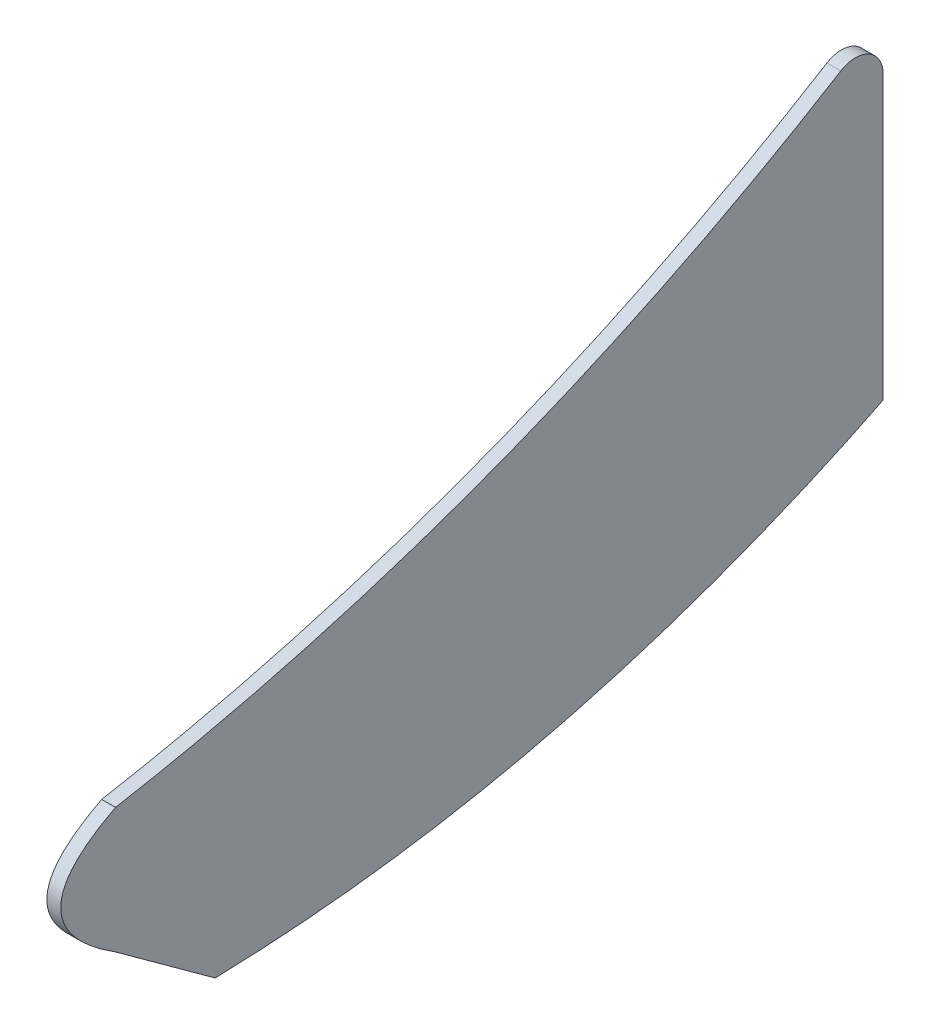
ISO-10303-21;
HEADER;
FILE_DESCRIPTION(('STEP AP214'),'2;1');
FILE_NAME('part.step','',(''),(''),'','','');
FILE_SCHEMA(('AUTOMOTIVE_DESIGN { 1 0 10303 214 1 1 1 1 }'));
ENDSEC;
DATA;
#1=APPLICATION_CONTEXT('core data for automotive mechanical design processes');
#2=APPLICATION_PROTOCOL_DEFINITION('international standard','automotive_design',2000,#1);
#3=PRODUCT_CONTEXT('',#1,'mechanical');
#4=PRODUCT('Part','Part','',(#3));
#5=PRODUCT_RELATED_PRODUCT_CATEGORY('part','',(#4));
#6=PRODUCT_DEFINITION_FORMATION('','',#4);
#7=PRODUCT_DEFINITION_CONTEXT('part definition',#1,'design');
#8=PRODUCT_DEFINITION('design','',#6,#7);
#9=PRODUCT_DEFINITION_SHAPE('','',#8);
#10=(LENGTH_UNIT() NAMED_UNIT(*) SI_UNIT(.MILLI.,.METRE.));
#11=(NAMED_UNIT(*) PLANE_ANGLE_UNIT() SI_UNIT($,.RADIAN.));
#12=(NAMED_UNIT(*) SI_UNIT($,.STERADIAN.) SOLID_ANGLE_UNIT());
#13=UNCERTAINTY_MEASURE_WITH_UNIT(LENGTH_MEASURE(1.E-05),#10,'distance_accuracy_value','');
#14=(GEOMETRIC_REPRESENTATION_CONTEXT(3) GLOBAL_UNCERTAINTY_ASSIGNED_CONTEXT((#13)) GLOBAL_UNIT_ASSIGNED_CONTEXT((#10,
#11,#12)) REPRESENTATION_CONTEXT('',''));
#15=CARTESIAN_POINT('',(0.,0.,0.));
#16=DIRECTION('',(0.,0.,1.));
#17=DIRECTION('',(1.,0.,0.));
#18=AXIS2_PLACEMENT_3D('',#15,#16,#17);
#19=CARTESIAN_POINT('',(12.7,-203.834480101122,59.3103390971955));
#20=DIRECTION('',(0.,-0.809090734465072,0.587683744375128));
#21=DIRECTION('',(0.,-0.587683744375128,-0.809090734465072));
#22=AXIS2_PLACEMENT_3D('',#19,#20,#21);
#23=PLANE('',#22);
#24=DIRECTION('',(0.,0.587683744375128,0.809090734465072));
#25=VECTOR('',#24,1.);
#26=CARTESIAN_POINT('',(12.7,-203.834480101122,59.3103390971955));
#27=LINE('',#26,#25);
#28=CARTESIAN_POINT('',(12.7,-203.834480101122,59.3103390971955));
#29=VERTEX_POINT('',#28);
#30=CARTESIAN_POINT('',(12.7,-138.076791236095,149.841917160667));
#31=VERTEX_POINT('',#30);
#32=EDGE_CURVE('E112',#29,#31,#27,.T.);
#33=ORIENTED_EDGE('',*,*,#32,.T.);
#34=DIRECTION('',(-1.,0.,0.));
#35=VECTOR('',#34,1.);
#36=CARTESIAN_POINT('',(12.7,-138.076791236095,149.841917160667));
#37=LINE('',#36,#35);
#38=CARTESIAN_POINT('',(0.,-138.076791236095,149.841917160667));
#39=VERTEX_POINT('',#38);
#40=EDGE_CURVE('E148',#31,#39,#37,.T.);
#41=ORIENTED_EDGE('',*,*,#40,.T.);
#42=DIRECTION('',(0.,0.587683744375128,0.809090734465072));
#43=VECTOR('',#42,1.);
#44=CARTESIAN_POINT('',(0.,-203.834480101122,59.3103390971955));
#45=LINE('',#44,#43);
#46=CARTESIAN_POINT('',(0.,-203.834480101122,59.3103390971955));
#47=VERTEX_POINT('',#46);
#48=EDGE_CURVE('E181',#47,#39,#45,.T.);
#49=ORIENTED_EDGE('',*,*,#48,.F.);
#50=DIRECTION('',(-1.,0.,0.));
#51=VECTOR('',#50,1.);
#52=CARTESIAN_POINT('',(12.7,-203.834480101122,59.3103390971955));
#53=LINE('',#52,#51);
#54=EDGE_CURVE('E157',#29,#47,#53,.T.);
#55=ORIENTED_EDGE('',*,*,#54,.F.);
#56=EDGE_LOOP('',(#33,#41,#49,#55));
#57=FACE_BOUND('',#56,.T.);
#58=ADVANCED_FACE('F32',(#57),#23,.T.);
#59=CARTESIAN_POINT('',(12.7,-203.834480101122,59.3103390971955));
#60=CARTESIAN_POINT('',(12.7,-195.881315466951,-261.653002311922));
#61=CARTESIAN_POINT('',(12.7,-51.4344824312386,-552.210156900728));
#62=B_SPLINE_CURVE_WITH_KNOTS('',2,(#59,#60,#61),.UNSPECIFIED.,.F.,.F.,(3,3),(0.,1.),.UNSPECIFIED.);
#63=DIRECTION('',(-1.,0.,0.));
#64=VECTOR('',#63,1.);
#65=SURFACE_OF_LINEAR_EXTRUSION('',#62,#64);
#66=CARTESIAN_POINT('',(0.,-203.834480101122,59.3103390971955));
#67=CARTESIAN_POINT('',(0.,-195.881315466951,-261.653002311922));
#68=CARTESIAN_POINT('',(0.,-51.4344824312386,-552.210156900728));
#69=B_SPLINE_CURVE_WITH_KNOTS('',2,(#66,#67,#68),.UNSPECIFIED.,.F.,.F.,(3,3),(0.,1.),.UNSPECIFIED.);
#70=CARTESIAN_POINT('',(0.,-51.4344824312386,-552.210156900728));
#71=VERTEX_POINT('',#70);
#72=EDGE_CURVE('E115',#47,#71,#69,.T.);
#73=ORIENTED_EDGE('',*,*,#72,.T.);
#74=DIRECTION('',(-1.,0.,0.));
#75=VECTOR('',#74,1.);
#76=CARTESIAN_POINT('',(12.7,-51.4344824312386,-552.210156900728));
#77=LINE('',#76,#75);
#78=CARTESIAN_POINT('',(12.7,-51.4344824312386,-552.210156900728));
#79=VERTEX_POINT('',#78);
#80=EDGE_CURVE('E108',#79,#71,#77,.T.);
#81=ORIENTED_EDGE('',*,*,#80,.F.);
#82=EDGE_CURVE('E109',#29,#79,#62,.T.);
#83=ORIENTED_EDGE('',*,*,#82,.F.);
#84=ORIENTED_EDGE('',*,*,#54,.T.);
#85=EDGE_LOOP('',(#73,#81,#83,#84));
#86=FACE_BOUND('',#85,.T.);
#87=ADVANCED_FACE('F133',(#86),#65,.F.);
#88=CARTESIAN_POINT('',(12.7,-51.4344824312386,-552.210156900728));
#89=DIRECTION('',(0.,0.,1.));
#90=DIRECTION('',(1.,0.,0.));
#91=AXIS2_PLACEMENT_3D('',#88,#89,#90);
#92=PLANE('',#91);
#93=DIRECTION('',(0.,1.,0.));
#94=VECTOR('',#93,1.);
#95=CARTESIAN_POINT('',(0.,-51.4344824312386,-552.210156900728));
#96=LINE('',#95,#94);
#97=CARTESIAN_POINT('',(0.,207.297963071722,-552.210156900728));
#98=VERTEX_POINT('',#97);
#99=EDGE_CURVE('E165',#71,#98,#96,.T.);
#100=ORIENTED_EDGE('',*,*,#99,.T.);
#101=DIRECTION('',(-1.,0.,0.));
#102=VECTOR('',#101,1.);
#103=CARTESIAN_POINT('',(12.7,207.297963071722,-552.210156900728));
#104=LINE('',#103,#102);
#105=CARTESIAN_POINT('',(12.7,207.297963071722,-552.210156900728));
#106=VERTEX_POINT('',#105);
#107=EDGE_CURVE('E146',#98,#106,#104,.F.);
#108=ORIENTED_EDGE('',*,*,#107,.T.);
#109=DIRECTION('',(0.,1.,0.));
#110=VECTOR('',#109,1.);
#111=CARTESIAN_POINT('',(12.7,-51.4344824312386,-552.210156900728));
#112=LINE('',#111,#110);
#113=EDGE_CURVE('E101',#79,#106,#112,.T.);
#114=ORIENTED_EDGE('',*,*,#113,.F.);
#115=ORIENTED_EDGE('',*,*,#80,.T.);
#116=EDGE_LOOP('',(#100,#108,#114,#115));
#117=FACE_BOUND('',#116,.T.);
#118=ADVANCED_FACE('F194',(#117),#92,.F.);
#119=CARTESIAN_POINT('',(12.7,253.365517568761,-552.210156900728));
#120=CARTESIAN_POINT('',(12.7,44.5731896652872,-229.842048285906));
#121=CARTESIAN_POINT('',(12.7,-22.9788378403413,150.50794475053));
#122=B_SPLINE_CURVE_WITH_KNOTS('',2,(#119,#120,#121),.UNSPECIFIED.,.F.,.F.,(3,3),(0.,1.),.UNSPECIFIED.);
#123=DIRECTION('',(-1.,0.,0.));
#124=VECTOR('',#123,1.);
#125=SURFACE_OF_LINEAR_EXTRUSION('',#122,#124);
#126=CARTESIAN_POINT('',(12.7,228.93459572066,-513.505416105999));
#127=VERTEX_POINT('',#126);
#128=CARTESIAN_POINT('',(12.7,-22.9788378403413,150.50794475053));
#129=VERTEX_POINT('',#128);
#130=EDGE_CURVE('E90',#127,#129,#122,.T.);
#131=ORIENTED_EDGE('',*,*,#130,.F.);
#132=DIRECTION('',(-1.,0.,0.));
#133=VECTOR('',#132,1.);
#134=CARTESIAN_POINT('',(12.7,228.93459572066,-513.505416105999));
#135=LINE('',#134,#133);
#136=CARTESIAN_POINT('',(0.,228.93459572066,-513.505416105999));
#137=VERTEX_POINT('',#136);
#138=EDGE_CURVE('E147',#127,#137,#135,.T.);
#139=ORIENTED_EDGE('',*,*,#138,.T.);
#140=CARTESIAN_POINT('',(0.,253.365517568761,-552.210156900728));
#141=CARTESIAN_POINT('',(0.,44.5731896652872,-229.842048285906));
#142=CARTESIAN_POINT('',(0.,-22.9788378403413,150.50794475053));
#143=B_SPLINE_CURVE_WITH_KNOTS('',2,(#140,#141,#142),.UNSPECIFIED.,.F.,.F.,(3,3),(0.,1.),.UNSPECIFIED.);
#144=CARTESIAN_POINT('',(0.,-22.9788378403413,150.50794475053));
#145=VERTEX_POINT('',#144);
#146=EDGE_CURVE('E107',#137,#145,#143,.T.);
#147=ORIENTED_EDGE('',*,*,#146,.T.);
#148=DIRECTION('',(-1.,0.,0.));
#149=VECTOR('',#148,1.);
#150=CARTESIAN_POINT('',(12.7,-22.9788378403413,150.50794475053));
#151=LINE('',#150,#149);
#152=EDGE_CURVE('E104',#129,#145,#151,.T.);
#153=ORIENTED_EDGE('',*,*,#152,.F.);
#154=EDGE_LOOP('',(#131,#139,#147,#153));
#155=FACE_BOUND('',#154,.T.);
#156=ADVANCED_FACE('F105',(#155),#125,.F.);
#157=CARTESIAN_POINT('',(12.7,-22.9788378403413,150.50794475053));
#158=CARTESIAN_POINT('',(12.7,-74.4602526014171,250.760296622026));
#159=CARTESIAN_POINT('',(12.7,-137.593021528701,150.50794475053));
#160=B_SPLINE_CURVE_WITH_KNOTS('',2,(#157,#158,#159),.UNSPECIFIED.,.F.,.F.,(3,3),(0.,1.),.UNSPECIFIED.);
#161=DIRECTION('',(-1.,0.,0.));
#162=VECTOR('',#161,1.);
#163=SURFACE_OF_LINEAR_EXTRUSION('',#160,#162);
#164=CARTESIAN_POINT('',(0.,-22.9788378403413,150.50794475053));
#165=CARTESIAN_POINT('',(0.,-74.4602526014171,250.760296622026));
#166=CARTESIAN_POINT('',(0.,-137.593021528701,150.50794475053));
#167=B_SPLINE_CURVE_WITH_KNOTS('',2,(#164,#165,#166),.UNSPECIFIED.,.F.,.F.,(3,3),(0.,1.),.UNSPECIFIED.);
#168=CARTESIAN_POINT('',(0.,-137.171686759178,151.1749799533));
#169=VERTEX_POINT('',#168);
#170=EDGE_CURVE('E174',#145,#169,#167,.T.);
#171=ORIENTED_EDGE('',*,*,#170,.T.);
#172=DIRECTION('',(-1.,0.,0.));
#173=VECTOR('',#172,1.);
#174=CARTESIAN_POINT('',(0.,-137.171686759178,151.1749799533));
#175=LINE('',#174,#173);
#176=CARTESIAN_POINT('',(12.7,-137.171686759178,151.1749799533));
#177=VERTEX_POINT('',#176);
#178=EDGE_CURVE('E47',#169,#177,#175,.F.);
#179=ORIENTED_EDGE('',*,*,#178,.T.);
#180=EDGE_CURVE('E94',#129,#177,#160,.T.);
#181=ORIENTED_EDGE('',*,*,#180,.F.);
#182=ORIENTED_EDGE('',*,*,#152,.T.);
#183=EDGE_LOOP('',(#171,#179,#181,#182));
#184=FACE_BOUND('',#183,.T.);
#185=ADVANCED_FACE('F111',(#184),#163,.F.);
#186=CARTESIAN_POINT('',(12.7,-77.3730911429692,200.634120686278));
#187=DIRECTION('',(-1.,0.,0.));
#188=DIRECTION('',(0.,0.,1.));
#189=AXIS2_PLACEMENT_3D('',#186,#187,#188);
#190=PLANE('',#189);
#191=ORIENTED_EDGE('',*,*,#113,.T.);
#192=CARTESIAN_POINT('',(12.7,207.297963071722,-526.810156900728));
#193=DIRECTION('',(-1.,0.,0.));
#194=DIRECTION('',(0.,0.,1.));
#195=AXIS2_PLACEMENT_3D('',#192,#193,#194);
#196=CIRCLE('',#195,25.4);
#197=EDGE_CURVE('E97',#106,#127,#196,.F.);
#198=ORIENTED_EDGE('',*,*,#197,.T.);
#199=ORIENTED_EDGE('',*,*,#130,.T.);
#200=ORIENTED_EDGE('',*,*,#180,.T.);
#201=CARTESIAN_POINT('',(12.7,-158.627695891508,164.769084267796));
#202=DIRECTION('',(-1.,0.,0.));
#203=DIRECTION('',(0.,0.,1.));
#204=AXIS2_PLACEMENT_3D('',#201,#202,#203);
#205=CIRCLE('',#204,25.4);
#206=EDGE_CURVE('E11',#177,#31,#205,.T.);
#207=ORIENTED_EDGE('',*,*,#206,.T.);
#208=ORIENTED_EDGE('',*,*,#32,.F.);
#209=ORIENTED_EDGE('',*,*,#82,.T.);
#210=EDGE_LOOP('',(#191,#198,#199,#200,#207,#208,#209));
#211=FACE_BOUND('',#210,.T.);
#212=ADVANCED_FACE('F93',(#211),#190,.F.);
#213=CARTESIAN_POINT('',(0.,-77.3730911429692,200.634120686278));
#214=DIRECTION('',(-1.,0.,0.));
#215=DIRECTION('',(0.,0.,1.));
#216=AXIS2_PLACEMENT_3D('',#213,#214,#215);
#217=PLANE('',#216);
#218=ORIENTED_EDGE('',*,*,#146,.F.);
#219=CARTESIAN_POINT('',(0.,207.297963071722,-526.810156900728));
#220=DIRECTION('',(-1.,0.,0.));
#221=DIRECTION('',(0.,0.,1.));
#222=AXIS2_PLACEMENT_3D('',#219,#220,#221);
#223=CIRCLE('',#222,25.4);
#224=EDGE_CURVE('E152',#137,#98,#223,.T.);
#225=ORIENTED_EDGE('',*,*,#224,.T.);
#226=ORIENTED_EDGE('',*,*,#99,.F.);
#227=ORIENTED_EDGE('',*,*,#72,.F.);
#228=ORIENTED_EDGE('',*,*,#48,.T.);
#229=CARTESIAN_POINT('',(0.,-158.627695891508,164.769084267796));
#230=DIRECTION('',(-1.,0.,0.));
#231=DIRECTION('',(0.,0.,1.));
#232=AXIS2_PLACEMENT_3D('',#229,#230,#231);
#233=CIRCLE('',#232,25.4);
#234=EDGE_CURVE('E40',#39,#169,#233,.F.);
#235=ORIENTED_EDGE('',*,*,#234,.T.);
#236=ORIENTED_EDGE('',*,*,#170,.F.);
#237=EDGE_LOOP('',(#218,#225,#226,#227,#228,#235,#236));
#238=FACE_BOUND('',#237,.T.);
#239=ADVANCED_FACE('F137',(#238),#217,.T.);
#240=CARTESIAN_POINT('',(6.35,207.297963071722,-526.810156900728));
#241=DIRECTION('',(-1.,0.,0.));
#242=DIRECTION('',(0.,0.,1.));
#243=AXIS2_PLACEMENT_3D('',#240,#241,#242);
#244=CYLINDRICAL_SURFACE('',#243,25.4);
#245=ORIENTED_EDGE('',*,*,#197,.F.);
#246=ORIENTED_EDGE('',*,*,#107,.F.);
#247=ORIENTED_EDGE('',*,*,#224,.F.);
#248=ORIENTED_EDGE('',*,*,#138,.F.);
#249=EDGE_LOOP('',(#245,#246,#247,#248));
#250=FACE_BOUND('',#249,.T.);
#251=ADVANCED_FACE('F135',(#250),#244,.T.);
#252=CARTESIAN_POINT('',(6.35,-158.627695891508,164.769084267796));
#253=DIRECTION('',(-1.,0.,0.));
#254=DIRECTION('',(0.,0.,1.));
#255=AXIS2_PLACEMENT_3D('',#252,#253,#254);
#256=CYLINDRICAL_SURFACE('',#255,25.4);
#257=ORIENTED_EDGE('',*,*,#206,.F.);
#258=ORIENTED_EDGE('',*,*,#178,.F.);
#259=ORIENTED_EDGE('',*,*,#234,.F.);
#260=ORIENTED_EDGE('',*,*,#40,.F.);
#261=EDGE_LOOP('',(#257,#258,#259,#260));
#262=FACE_BOUND('',#261,.T.);
#263=ADVANCED_FACE('F34',(#262),#256,.F.);
#264=CLOSED_SHELL('',(#58,#87,#118,#156,#185,#212,#239,#251,#263));
#265=MANIFOLD_SOLID_BREP('B2',#264);
#266=ADVANCED_BREP_SHAPE_REPRESENTATION('',(#18,#265),#14);
#267=SHAPE_DEFINITION_REPRESENTATION(#9,#266);
ENDSEC;
END-ISO-10303-21;
